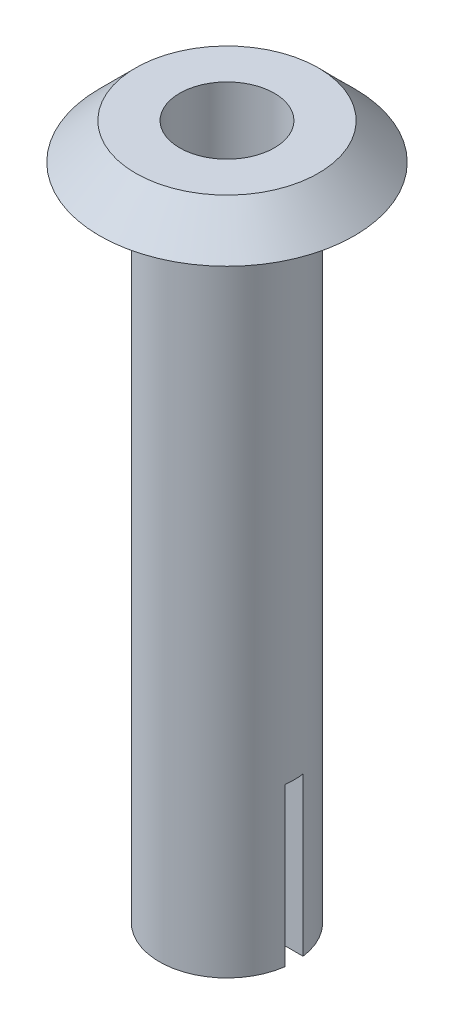
ISO-10303-21;
HEADER;
FILE_DESCRIPTION(('STEP AP214'),'2;1');
FILE_NAME('part.step','',(''),(''),'','','');
FILE_SCHEMA(('AUTOMOTIVE_DESIGN { 1 0 10303 214 1 1 1 1 }'));
ENDSEC;
DATA;
#1=APPLICATION_CONTEXT('core data for automotive mechanical design processes');
#2=APPLICATION_PROTOCOL_DEFINITION('international standard','automotive_design',2000,#1);
#3=PRODUCT_CONTEXT('',#1,'mechanical');
#4=PRODUCT('Part','Part','',(#3));
#5=PRODUCT_RELATED_PRODUCT_CATEGORY('part','',(#4));
#6=PRODUCT_DEFINITION_FORMATION('','',#4);
#7=PRODUCT_DEFINITION_CONTEXT('part definition',#1,'design');
#8=PRODUCT_DEFINITION('design','',#6,#7);
#9=PRODUCT_DEFINITION_SHAPE('','',#8);
#10=(LENGTH_UNIT() NAMED_UNIT(*) SI_UNIT(.MILLI.,.METRE.));
#11=(NAMED_UNIT(*) PLANE_ANGLE_UNIT() SI_UNIT($,.RADIAN.));
#12=(NAMED_UNIT(*) SI_UNIT($,.STERADIAN.) SOLID_ANGLE_UNIT());
#13=UNCERTAINTY_MEASURE_WITH_UNIT(LENGTH_MEASURE(1.E-05),#10,'distance_accuracy_value','');
#14=(GEOMETRIC_REPRESENTATION_CONTEXT(3) GLOBAL_UNCERTAINTY_ASSIGNED_CONTEXT((#13)) GLOBAL_UNIT_ASSIGNED_CONTEXT((#10,
#11,#12)) REPRESENTATION_CONTEXT('',''));
#15=CARTESIAN_POINT('',(0.,0.,0.));
#16=DIRECTION('',(0.,0.,1.));
#17=DIRECTION('',(1.,0.,0.));
#18=AXIS2_PLACEMENT_3D('',#15,#16,#17);
#19=CARTESIAN_POINT('',(0.,0.,0.));
#20=DIRECTION('',(0.,1.,0.));
#21=DIRECTION('',(0.,0.,1.));
#22=AXIS2_PLACEMENT_3D('',#19,#20,#21);
#23=PLANE('',#22);
#24=CARTESIAN_POINT('',(0.,0.,0.));
#25=DIRECTION('',(0.,1.,0.));
#26=DIRECTION('',(0.,0.,1.));
#27=AXIS2_PLACEMENT_3D('',#24,#25,#26);
#28=CIRCLE('',#27,1.5);
#29=CARTESIAN_POINT('',(1.48660687473185,0.,-0.2));
#30=VERTEX_POINT('',#29);
#31=CARTESIAN_POINT('',(-1.48660687473185,0.,-0.2));
#32=VERTEX_POINT('',#31);
#33=EDGE_CURVE('E130',#30,#32,#28,.T.);
#34=ORIENTED_EDGE('',*,*,#33,.F.);
#35=DIRECTION('',(1.,0.,0.));
#36=VECTOR('',#35,1.);
#37=CARTESIAN_POINT('',(-1.5,0.,-0.2));
#38=LINE('',#37,#36);
#39=EDGE_CURVE('E117',#32,#30,#38,.T.);
#40=ORIENTED_EDGE('',*,*,#39,.F.);
#41=EDGE_LOOP('',(#34,#40));
#42=FACE_BOUND('',#41,.T.);
#43=ADVANCED_FACE('F34',(#42),#23,.F.);
#44=CARTESIAN_POINT('',(0.,1.5001,0.));
#45=DIRECTION('',(0.,1.,0.));
#46=DIRECTION('',(0.,0.,1.));
#47=AXIS2_PLACEMENT_3D('',#44,#45,#46);
#48=PLANE('',#47);
#49=DIRECTION('',(-1.,0.,0.));
#50=VECTOR('',#49,1.);
#51=CARTESIAN_POINT('',(0.,1.5001,-0.2));
#52=LINE('',#51,#50);
#53=CARTESIAN_POINT('',(0.15,1.5001,-0.2));
#54=VERTEX_POINT('',#53);
#55=CARTESIAN_POINT('',(-0.150000000000001,1.50009999999999,-0.2));
#56=VERTEX_POINT('',#55);
#57=EDGE_CURVE('E127',#54,#56,#52,.T.);
#58=ORIENTED_EDGE('',*,*,#57,.F.);
#59=CARTESIAN_POINT('',(0.,1.5001,0.));
#60=DIRECTION('',(0.,1.,0.));
#61=DIRECTION('',(0.,0.,1.));
#62=AXIS2_PLACEMENT_3D('',#59,#60,#61);
#63=CIRCLE('',#62,0.25);
#64=EDGE_CURVE('E151',#54,#56,#63,.T.);
#65=ORIENTED_EDGE('',*,*,#64,.T.);
#66=EDGE_LOOP('',(#58,#65));
#67=FACE_BOUND('',#66,.T.);
#68=ADVANCED_FACE('F176',(#67),#48,.T.);
#69=CARTESIAN_POINT('',(0.,2.3001,0.));
#70=DIRECTION('',(0.,1.,0.));
#71=DIRECTION('',(0.,0.,1.));
#72=AXIS2_PLACEMENT_3D('',#69,#70,#71);
#73=DEGENERATE_TOROIDAL_SURFACE('',#72,0.25,0.8,.T.);
#74=ORIENTED_EDGE('',*,*,#64,.F.);
#75=CARTESIAN_POINT('',(0.,1.50166402886642,-0.2));
#76=CARTESIAN_POINT('',(0.0166698415826688,1.50166571667046,-0.2));
#77=CARTESIAN_POINT('',(0.0333398856129194,1.5015243846989,-0.2));
#78=CARTESIAN_POINT('',(0.0666781693266342,1.50108013124724,-0.2));
#79=CARTESIAN_POINT('',(0.0833464085193591,1.50077718944308,-0.2));
#80=CARTESIAN_POINT('',(0.1334092614839,1.50005060911422,-0.2));
#81=CARTESIAN_POINT('',(0.166812993914217,1.49981064587632,-0.2));
#82=CARTESIAN_POINT('',(0.229406412635807,1.50162846407508,-0.2));
#83=CARTESIAN_POINT('',(0.258601027229079,1.5034028341242,-0.2));
#84=CARTESIAN_POINT('',(0.316743266893158,1.50943838792807,-0.2));
#85=CARTESIAN_POINT('',(0.345690900061749,1.51369948982991,-0.2));
#86=CARTESIAN_POINT('',(0.402991969738191,1.52499097991025,-0.2));
#87=CARTESIAN_POINT('',(0.43134645596889,1.53201594533592,-0.2));
#88=CARTESIAN_POINT('',(0.487189985294854,1.54892644422566,-0.2));
#89=CARTESIAN_POINT('',(0.51467891698504,1.55881234426391,-0.2));
#90=CARTESIAN_POINT('',(0.583350982841369,1.58770457877811,-0.2));
#91=CARTESIAN_POINT('',(0.623707050723279,1.608732010134,-0.2));
#92=CARTESIAN_POINT('',(0.70034544039585,1.65728696231791,-0.2));
#93=CARTESIAN_POINT('',(0.736623667136238,1.68482093259039,-0.2));
#94=CARTESIAN_POINT('',(0.8039971339138,1.74568309567333,-0.2));
#95=CARTESIAN_POINT('',(0.835088877571679,1.77901516649863,-0.2));
#96=CARTESIAN_POINT('',(0.891088036855366,1.85049982703332,-0.2));
#97=CARTESIAN_POINT('',(0.91599833710029,1.88865015567519,-0.2));
#98=CARTESIAN_POINT('',(0.958481280077041,1.96790347324701,-0.2));
#99=CARTESIAN_POINT('',(0.976184281869382,2.00893663331438,-0.2));
#100=CARTESIAN_POINT('',(1.00439993048064,2.09340914612502,-0.2));
#101=CARTESIAN_POINT('',(1.01491219899784,2.13684862533388,-0.2));
#102=CARTESIAN_POINT('',(1.02838751393651,2.22458296266082,-0.2));
#103=CARTESIAN_POINT('',(1.03140084062819,2.26887010627033,-0.2));
#104=CARTESIAN_POINT('',(1.02993685654376,2.35732453651702,-0.2));
#105=CARTESIAN_POINT('',(1.02545891825336,2.40149181280298,-0.2));
#106=CARTESIAN_POINT('',(1.00915342271604,2.48838340979925,-0.2));
#107=CARTESIAN_POINT('',(0.997336178055473,2.5311096666496,-0.2));
#108=CARTESIAN_POINT('',(0.966713242045891,2.61395512181443,-0.2));
#109=CARTESIAN_POINT('',(0.947910965567331,2.6540755828194,-0.2));
#110=CARTESIAN_POINT('',(0.903839144046234,2.73065069145779,-0.2));
#111=CARTESIAN_POINT('',(0.878562317198208,2.76710114677823,-0.2));
#112=CARTESIAN_POINT('',(0.822245470323173,2.83532842733279,-0.2));
#113=CARTESIAN_POINT('',(0.791196792082228,2.86709810098076,-0.2));
#114=CARTESIAN_POINT('',(0.724008067566469,2.92527142435174,-0.2));
#115=CARTESIAN_POINT('',(0.687830871368458,2.95163214192628,-0.2));
#116=CARTESIAN_POINT('',(0.611776285106589,2.9979354345787,-0.2));
#117=CARTESIAN_POINT('',(0.571913327608463,3.01790178231344,-0.2));
#118=CARTESIAN_POINT('',(0.488698905847722,3.05152795161462,-0.2));
#119=CARTESIAN_POINT('',(0.445293861557957,3.06505457212068,-0.2));
#120=CARTESIAN_POINT('',(0.356717442684082,3.08530811915976,-0.2));
#121=CARTESIAN_POINT('',(0.311537986720364,3.09199895064935,-0.2));
#122=CARTESIAN_POINT('',(0.243810832825528,3.09765746387715,-0.2));
#123=CARTESIAN_POINT('',(0.221405555467714,3.09882104800239,-0.2));
#124=CARTESIAN_POINT('',(0.176559166379535,3.10008848768721,-0.2));
#125=CARTESIAN_POINT('',(0.154118045261468,3.10019199329407,-0.2));
#126=CARTESIAN_POINT('',(0.109196727516646,3.09986873007227,-0.2));
#127=CARTESIAN_POINT('',(0.086716553458095,3.09944079485711,-0.2));
#128=CARTESIAN_POINT('',(0.0417602725450971,3.09876428051567,-0.2));
#129=CARTESIAN_POINT('',(0.0192841675849667,3.09851563069695,-0.2));
#130=CARTESIAN_POINT('',(-0.0256602785195892,3.0985594930865,-0.2));
#131=CARTESIAN_POINT('',(-0.0481286199316127,3.09885183940198,-0.2));
#132=CARTESIAN_POINT('',(-0.0930716344119249,3.09955118293042,-0.2));
#133=CARTESIAN_POINT('',(-0.11554630617063,3.09995822829498,-0.2));
#134=CARTESIAN_POINT('',(-0.160455392283717,3.10018035007007,-0.2));
#135=CARTESIAN_POINT('',(-0.182889787694873,3.09999671397185,-0.2));
#136=CARTESIAN_POINT('',(-0.227717260508837,3.09852636404797,-0.2));
#137=CARTESIAN_POINT('',(-0.250110352920595,3.09724019939141,-0.2));
#138=CARTESIAN_POINT('',(-0.296297968778293,3.09312072295697,-0.2));
#139=CARTESIAN_POINT('',(-0.320084183523528,3.09018810205309,-0.2));
#140=CARTESIAN_POINT('',(-0.367381071661446,3.08251258442502,-0.2));
#141=CARTESIAN_POINT('',(-0.390891486534654,3.07776811045488,-0.2));
#142=CARTESIAN_POINT('',(-0.460460798783884,3.06072186606951,-0.2));
#143=CARTESIAN_POINT('',(-0.505869337426221,3.04558316011647,-0.2));
#144=CARTESIAN_POINT('',(-0.593621321286191,3.00758337797835,-0.2));
#145=CARTESIAN_POINT('',(-0.635946841713136,2.98468093791962,-0.2));
#146=CARTESIAN_POINT('',(-0.716023573084662,2.93160345969393,-0.2));
#147=CARTESIAN_POINT('',(-0.753756166231605,2.90140021266384,-0.2));
#148=CARTESIAN_POINT('',(-0.82122693284102,2.83652498131007,-0.2));
#149=CARTESIAN_POINT('',(-0.85129133705298,2.80219152148355,-0.2));
#150=CARTESIAN_POINT('',(-0.905034875406045,2.72893181931438,-0.2));
#151=CARTESIAN_POINT('',(-0.928725093673388,2.69001372097015,-0.2));
#152=CARTESIAN_POINT('',(-0.968651849943626,2.60950280684566,-0.2));
#153=CARTESIAN_POINT('',(-0.985028556964881,2.5679794247673,-0.2));
#154=CARTESIAN_POINT('',(-1.01053977879569,2.48274183353331,-0.2));
#155=CARTESIAN_POINT('',(-1.01967100083736,2.43902663787444,-0.2));
#156=CARTESIAN_POINT('',(-1.03037488252278,2.35095439400306,-0.2));
#157=CARTESIAN_POINT('',(-1.0319936625118,2.30660294352136,-0.2));
#158=CARTESIAN_POINT('',(-1.02775164201873,2.21826517229983,-0.2));
#159=CARTESIAN_POINT('',(-1.0218918980028,2.17427880086995,-0.2));
#160=CARTESIAN_POINT('',(-1.00287715257568,2.08796873376396,-0.2));
#161=CARTESIAN_POINT('',(-0.989730984078272,2.0456430912738,-0.2));
#162=CARTESIAN_POINT('',(-0.956532739392012,1.9637942509764,-0.2));
#163=CARTESIAN_POINT('',(-0.936480727484413,1.92427102708769,-0.2));
#164=CARTESIAN_POINT('',(-0.89000930653147,1.84906071693307,-0.2));
#165=CARTESIAN_POINT('',(-0.863577783044371,1.81338111826882,-0.2));
#166=CARTESIAN_POINT('',(-0.805135950061446,1.74692476724933,-0.2));
#167=CARTESIAN_POINT('',(-0.773124960237336,1.71614861366918,-0.2));
#168=CARTESIAN_POINT('',(-0.704201964591778,1.66011251929112,-0.2));
#169=CARTESIAN_POINT('',(-0.667255690928788,1.63489475116404,-0.2));
#170=CARTESIAN_POINT('',(-0.589750741014979,1.59087804904981,-0.2));
#171=CARTESIAN_POINT('',(-0.549193354238049,1.5720768353066,-0.2));
#172=CARTESIAN_POINT('',(-0.464618124035503,1.54082506566216,-0.2));
#173=CARTESIAN_POINT('',(-0.420541481173459,1.52853355976589,-0.2));
#174=CARTESIAN_POINT('',(-0.353478204694671,1.51519374710883,-0.2));
#175=CARTESIAN_POINT('',(-0.330958738023759,1.51159639946551,-0.2));
#176=CARTESIAN_POINT('',(-0.285725184481576,1.50596298451672,-0.2));
#177=CARTESIAN_POINT('',(-0.263011112275252,1.50392680059455,-0.2));
#178=CARTESIAN_POINT('',(-0.220265046414644,1.50134704085338,-0.2));
#179=CARTESIAN_POINT('',(-0.200241187409336,1.50065263236869,-0.2));
#180=CARTESIAN_POINT('',(-0.160181956336417,1.50000890941707,-0.2));
#181=CARTESIAN_POINT('',(-0.140146582936294,1.50005971462649,-0.2));
#182=CARTESIAN_POINT('',(-0.100092386262173,1.50048895406501,-0.2));
#183=CARTESIAN_POINT('',(-0.0800735597774635,1.50086721965425,-0.2));
#184=CARTESIAN_POINT('',(-0.0400365856593522,1.50145372536468,-0.2));
#185=CARTESIAN_POINT('',(-0.0200184388052065,1.50166200202041,-0.2));
#186=CARTESIAN_POINT('',(0.,1.50166402886642,-0.2));
#187=B_SPLINE_CURVE_WITH_KNOTS('',3,(#75,#76,#77,#78,#79,#80,#81,#82,#83,#84,#85,#86,#87,#88,
#89,#90,#91,#92,#93,#94,#95,#96,#97,#98,#99,#100,#101,#102,#103,#104,#105,#106,#107,#108,#109,
#110,#111,#112,#113,#114,#115,#116,#117,#118,#119,#120,#121,#122,#123,#124,#125,#126,#127,#128,
#129,#130,#131,#132,#133,#134,#135,#136,#137,#138,#139,#140,#141,#142,#143,#144,#145,#146,#147,
#148,#149,#150,#151,#152,#153,#154,#155,#156,#157,#158,#159,#160,#161,#162,#163,#164,#165,#166,
#167,#168,#169,#170,#171,#172,#173,#174,#175,#176,#177,#178,#179,#180,#181,#182,#183,#184,#185,
#186),.UNSPECIFIED.,.T.,.F.,(4,2,2,2,2,2,2,2,2,2,2,2,2,2,2,2,2,2,2,2,2,2,2,2,2,2,2,2,2,2,2,2,2,
2,2,2,2,2,2,2,2,2,2,2,2,2,2,2,2,2,2,2,2,2,2,4),(0.,0.0500092875870138,0.100024865829181,
0.200203184706985,0.287861777597849,0.375517485293757,0.463002061677427,0.550497852506859,
0.686345267481207,0.822327906861565,0.958401849368154,1.09441217197756,1.22783965644739,
1.36127415994634,1.49381154741136,1.62636003757694,1.75872270162411,1.8910207406544,
2.02346823117991,2.15611603011067,2.28977910205329,2.42293931893524,2.55874556687355,
2.69526526367023,2.76254952674017,2.82985600094964,2.89731045831805,2.96473830375306,
3.03214547632458,3.09958098925381,3.16686961463669,3.23412474304008,3.3059556878525,
3.37784930567182,3.52070973803225,3.66434359216108,3.80854154820458,3.94478310926737,
4.08078620473341,4.21405728780716,4.34738890234448,4.4799008756818,4.61239413156609,
4.74472712366483,4.87705888400943,5.00964394211279,5.14224517820572,5.27582027582979,
5.40934786564634,5.54600276763964,5.6143717931752,5.68273571114481,5.74282493822376,
5.80292381533889,5.86299176034259,5.9230467919569),.UNSPECIFIED.);
#188=CARTESIAN_POINT('',(1.03077640640442,2.3001,-0.2));
#189=VERTEX_POINT('',#188);
#190=EDGE_CURVE('E252',#54,#189,#187,.T.);
#191=ORIENTED_EDGE('',*,*,#190,.T.);
#192=CARTESIAN_POINT('',(0.,2.3001,0.));
#193=DIRECTION('',(0.,1.,0.));
#194=DIRECTION('',(0.,0.,1.));
#195=AXIS2_PLACEMENT_3D('',#192,#193,#194);
#196=CIRCLE('',#195,1.05);
#197=CARTESIAN_POINT('',(-1.03077640641938,2.30010000000522,-0.2));
#198=VERTEX_POINT('',#197);
#199=EDGE_CURVE('E155',#198,#189,#196,.F.);
#200=ORIENTED_EDGE('',*,*,#199,.F.);
#201=EDGE_CURVE('E161',#198,#56,#187,.T.);
#202=ORIENTED_EDGE('',*,*,#201,.T.);
#203=EDGE_LOOP('',(#74,#191,#200,#202));
#204=FACE_BOUND('',#203,.T.);
#205=ADVANCED_FACE('F196',(#204),#73,.F.);
#206=CARTESIAN_POINT('',(0.,15.4,0.));
#207=DIRECTION('',(0.,-1.,0.));
#208=DIRECTION('',(0.,0.,-1.));
#209=AXIS2_PLACEMENT_3D('',#206,#207,#208);
#210=CYLINDRICAL_SURFACE('',#209,1.5);
#211=CARTESIAN_POINT('',(0.,3.5,0.));
#212=DIRECTION('',(0.,-1.,0.));
#213=DIRECTION('',(0.,0.,-1.));
#214=AXIS2_PLACEMENT_3D('',#211,#212,#213);
#215=CIRCLE('',#214,1.5);
#216=CARTESIAN_POINT('',(1.48660687473185,3.5,-0.2));
#217=VERTEX_POINT('',#216);
#218=CARTESIAN_POINT('',(1.48660687473185,3.5,0.2));
#219=VERTEX_POINT('',#218);
#220=EDGE_CURVE('E214',#217,#219,#215,.T.);
#221=ORIENTED_EDGE('',*,*,#220,.F.);
#222=DIRECTION('',(0.,-1.,0.));
#223=VECTOR('',#222,1.);
#224=CARTESIAN_POINT('',(1.48660687473185,15.4,-0.2));
#225=LINE('',#224,#223);
#226=EDGE_CURVE('E213',#217,#30,#225,.T.);
#227=ORIENTED_EDGE('',*,*,#226,.T.);
#228=ORIENTED_EDGE('',*,*,#33,.T.);
#229=DIRECTION('',(0.,-1.,0.));
#230=VECTOR('',#229,1.);
#231=CARTESIAN_POINT('',(-1.48660687473185,15.4,-0.2));
#232=LINE('',#231,#230);
#233=CARTESIAN_POINT('',(-1.48660687473185,3.5,-0.2));
#234=VERTEX_POINT('',#233);
#235=EDGE_CURVE('E212',#32,#234,#232,.F.);
#236=ORIENTED_EDGE('',*,*,#235,.T.);
#237=CARTESIAN_POINT('',(-1.48660687473185,3.5,0.2));
#238=VERTEX_POINT('',#237);
#239=EDGE_CURVE('E126',#238,#234,#215,.T.);
#240=ORIENTED_EDGE('',*,*,#239,.F.);
#241=DIRECTION('',(0.,-1.,0.));
#242=VECTOR('',#241,1.);
#243=CARTESIAN_POINT('',(-1.48660687473185,15.4,0.2));
#244=LINE('',#243,#242);
#245=CARTESIAN_POINT('',(-1.48660687473185,0.,0.2));
#246=VERTEX_POINT('',#245);
#247=EDGE_CURVE('E112',#238,#246,#244,.T.);
#248=ORIENTED_EDGE('',*,*,#247,.T.);
#249=CARTESIAN_POINT('',(1.48660687473185,0.,0.2));
#250=VERTEX_POINT('',#249);
#251=EDGE_CURVE('E124',#246,#250,#28,.T.);
#252=ORIENTED_EDGE('',*,*,#251,.T.);
#253=DIRECTION('',(0.,-1.,0.));
#254=VECTOR('',#253,1.);
#255=CARTESIAN_POINT('',(1.48660687473185,15.4,0.2));
#256=LINE('',#255,#254);
#257=EDGE_CURVE('E50',#250,#219,#256,.F.);
#258=ORIENTED_EDGE('',*,*,#257,.T.);
#259=EDGE_LOOP('',(#221,#227,#228,#236,#240,#248,#252,#258));
#260=FACE_BOUND('',#259,.T.);
#261=CARTESIAN_POINT('',(0.,14.6,0.));
#262=DIRECTION('',(0.,1.,0.));
#263=DIRECTION('',(0.,0.,1.));
#264=AXIS2_PLACEMENT_3D('',#261,#262,#263);
#265=CIRCLE('',#264,1.5);
#266=CARTESIAN_POINT('',(0.,14.6,1.5));
#267=VERTEX_POINT('',#266);
#268=EDGE_CURVE('E134',#267,#267,#265,.T.);
#269=ORIENTED_EDGE('',*,*,#268,.F.);
#270=EDGE_LOOP('',(#269));
#271=FACE_BOUND('',#270,.T.);
#272=ADVANCED_FACE('F122',(#260,#271),#210,.T.);
#273=ORIENTED_EDGE('',*,*,#251,.F.);
#274=DIRECTION('',(-1.,0.,0.));
#275=VECTOR('',#274,1.);
#276=CARTESIAN_POINT('',(-1.5,0.,0.2));
#277=LINE('',#276,#275);
#278=EDGE_CURVE('E108',#250,#246,#277,.T.);
#279=ORIENTED_EDGE('',*,*,#278,.F.);
#280=EDGE_LOOP('',(#273,#279));
#281=FACE_BOUND('',#280,.T.);
#282=ADVANCED_FACE('F129',(#281),#23,.F.);
#283=CARTESIAN_POINT('',(0.,14.6,0.));
#284=DIRECTION('',(0.,1.,0.));
#285=DIRECTION('',(0.,0.,1.));
#286=AXIS2_PLACEMENT_3D('',#283,#284,#285);
#287=PLANE('',#286);
#288=CARTESIAN_POINT('',(0.,14.6,0.));
#289=DIRECTION('',(0.,1.,0.));
#290=DIRECTION('',(0.,0.,1.));
#291=AXIS2_PLACEMENT_3D('',#288,#289,#290);
#292=CIRCLE('',#291,2.825);
#293=CARTESIAN_POINT('',(0.,14.6,2.825));
#294=VERTEX_POINT('',#293);
#295=EDGE_CURVE('E131',#294,#294,#292,.T.);
#296=ORIENTED_EDGE('',*,*,#295,.F.);
#297=EDGE_LOOP('',(#296));
#298=FACE_BOUND('',#297,.T.);
#299=ORIENTED_EDGE('',*,*,#268,.T.);
#300=EDGE_LOOP('',(#299));
#301=FACE_BOUND('',#300,.T.);
#302=ADVANCED_FACE('F186',(#298,#301),#287,.F.);
#303=CARTESIAN_POINT('',(0.,14.6,0.));
#304=DIRECTION('',(0.,1.,0.));
#305=DIRECTION('',(0.,0.,1.));
#306=AXIS2_PLACEMENT_3D('',#303,#304,#305);
#307=CYLINDRICAL_SURFACE('',#306,2.825);
#308=CARTESIAN_POINT('',(0.,14.6001,0.));
#309=DIRECTION('',(0.,1.,0.));
#310=DIRECTION('',(0.,0.,1.));
#311=AXIS2_PLACEMENT_3D('',#308,#309,#310);
#312=CIRCLE('',#311,2.825);
#313=CARTESIAN_POINT('',(0.,14.6001,2.825));
#314=VERTEX_POINT('',#313);
#315=EDGE_CURVE('E145',#314,#314,#312,.F.);
#316=ORIENTED_EDGE('',*,*,#315,.T.);
#317=EDGE_LOOP('',(#316));
#318=FACE_BOUND('',#317,.T.);
#319=ORIENTED_EDGE('',*,*,#295,.T.);
#320=EDGE_LOOP('',(#319));
#321=FACE_BOUND('',#320,.T.);
#322=ADVANCED_FACE('F184',(#318,#321),#307,.T.);
#323=CARTESIAN_POINT('',(0.,15.4001,0.));
#324=DIRECTION('',(0.,1.,0.));
#325=DIRECTION('',(0.,0.,1.));
#326=AXIS2_PLACEMENT_3D('',#323,#324,#325);
#327=PLANE('',#326);
#328=CARTESIAN_POINT('',(0.,15.4001,0.));
#329=DIRECTION('',(0.,1.,0.));
#330=DIRECTION('',(0.,0.,1.));
#331=AXIS2_PLACEMENT_3D('',#328,#329,#330);
#332=CIRCLE('',#331,1.05);
#333=CARTESIAN_POINT('',(0.,15.4001,1.05));
#334=VERTEX_POINT('',#333);
#335=EDGE_CURVE('E136',#334,#334,#332,.T.);
#336=ORIENTED_EDGE('',*,*,#335,.F.);
#337=EDGE_LOOP('',(#336));
#338=FACE_BOUND('',#337,.T.);
#339=CARTESIAN_POINT('',(0.,15.4001,0.));
#340=DIRECTION('',(0.,1.,0.));
#341=DIRECTION('',(0.,0.,1.));
#342=AXIS2_PLACEMENT_3D('',#339,#340,#341);
#343=CIRCLE('',#342,2.025);
#344=CARTESIAN_POINT('',(0.,15.4001,2.025));
#345=VERTEX_POINT('',#344);
#346=EDGE_CURVE('E142',#345,#345,#343,.T.);
#347=ORIENTED_EDGE('',*,*,#346,.T.);
#348=EDGE_LOOP('',(#347));
#349=FACE_BOUND('',#348,.T.);
#350=ADVANCED_FACE('F181',(#338,#349),#327,.T.);
#351=CARTESIAN_POINT('',(0.,15.4001,0.));
#352=DIRECTION('',(0.,-1.,0.));
#353=DIRECTION('',(0.,0.,-1.));
#354=AXIS2_PLACEMENT_3D('',#351,#352,#353);
#355=CONICAL_SURFACE('',#354,2.025,0.785398163397447);
#356=ORIENTED_EDGE('',*,*,#315,.F.);
#357=EDGE_LOOP('',(#356));
#358=FACE_BOUND('',#357,.T.);
#359=ORIENTED_EDGE('',*,*,#346,.F.);
#360=EDGE_LOOP('',(#359));
#361=FACE_BOUND('',#360,.T.);
#362=ADVANCED_FACE('F179',(#358,#361),#355,.T.);
#363=CARTESIAN_POINT('',(0.,1.5001,0.));
#364=DIRECTION('',(0.,1.,0.));
#365=DIRECTION('',(0.,0.,1.));
#366=AXIS2_PLACEMENT_3D('',#363,#364,#365);
#367=CYLINDRICAL_SURFACE('',#366,1.05);
#368=CARTESIAN_POINT('',(0.,3.5,0.));
#369=DIRECTION('',(0.,-1.,0.));
#370=DIRECTION('',(0.,0.,-1.));
#371=AXIS2_PLACEMENT_3D('',#368,#369,#370);
#372=CIRCLE('',#371,1.05);
#373=CARTESIAN_POINT('',(-1.03077640640442,3.5,-0.2));
#374=VERTEX_POINT('',#373);
#375=CARTESIAN_POINT('',(-1.03077640640442,3.5,0.2));
#376=VERTEX_POINT('',#375);
#377=EDGE_CURVE('E11',#374,#376,#372,.F.);
#378=ORIENTED_EDGE('',*,*,#377,.F.);
#379=DIRECTION('',(0.,1.,0.));
#380=VECTOR('',#379,1.);
#381=CARTESIAN_POINT('',(-1.03077640640442,1.5001,-0.2));
#382=LINE('',#381,#380);
#383=EDGE_CURVE('E245',#374,#198,#382,.F.);
#384=ORIENTED_EDGE('',*,*,#383,.T.);
#385=ORIENTED_EDGE('',*,*,#199,.T.);
#386=DIRECTION('',(0.,1.,0.));
#387=VECTOR('',#386,1.);
#388=CARTESIAN_POINT('',(1.03077640640442,1.5001,-0.2));
#389=LINE('',#388,#387);
#390=CARTESIAN_POINT('',(1.03077640640442,3.5,-0.2));
#391=VERTEX_POINT('',#390);
#392=EDGE_CURVE('E220',#189,#391,#389,.T.);
#393=ORIENTED_EDGE('',*,*,#392,.T.);
#394=CARTESIAN_POINT('',(1.03077640640442,3.5,0.2));
#395=VERTEX_POINT('',#394);
#396=EDGE_CURVE('E39',#395,#391,#372,.F.);
#397=ORIENTED_EDGE('',*,*,#396,.F.);
#398=DIRECTION('',(0.,1.,0.));
#399=VECTOR('',#398,1.);
#400=CARTESIAN_POINT('',(1.03077640640442,1.5001,0.2));
#401=LINE('',#400,#399);
#402=CARTESIAN_POINT('',(1.03077640641938,2.30010000000522,0.2));
#403=VERTEX_POINT('',#402);
#404=EDGE_CURVE('E235',#395,#403,#401,.F.);
#405=ORIENTED_EDGE('',*,*,#404,.T.);
#406=CARTESIAN_POINT('',(-1.03077640640442,2.3001,0.2));
#407=VERTEX_POINT('',#406);
#408=EDGE_CURVE('E152',#403,#407,#196,.F.);
#409=ORIENTED_EDGE('',*,*,#408,.T.);
#410=DIRECTION('',(0.,1.,0.));
#411=VECTOR('',#410,1.);
#412=CARTESIAN_POINT('',(-1.03077640640442,1.5001,0.2));
#413=LINE('',#412,#411);
#414=EDGE_CURVE('E238',#407,#376,#413,.T.);
#415=ORIENTED_EDGE('',*,*,#414,.T.);
#416=EDGE_LOOP('',(#378,#384,#385,#393,#397,#405,#409,#415));
#417=FACE_BOUND('',#416,.T.);
#418=ORIENTED_EDGE('',*,*,#335,.T.);
#419=EDGE_LOOP('',(#418));
#420=FACE_BOUND('',#419,.T.);
#421=ADVANCED_FACE('F174',(#417,#420),#367,.F.);
#422=DIRECTION('',(1.,0.,0.));
#423=VECTOR('',#422,1.);
#424=CARTESIAN_POINT('',(0.,1.5001,0.2));
#425=LINE('',#424,#423);
#426=CARTESIAN_POINT('',(-0.15,1.5001,0.2));
#427=VERTEX_POINT('',#426);
#428=CARTESIAN_POINT('',(0.15,1.5001,0.2));
#429=VERTEX_POINT('',#428);
#430=EDGE_CURVE('E57',#427,#429,#425,.T.);
#431=ORIENTED_EDGE('',*,*,#430,.F.);
#432=EDGE_CURVE('E148',#427,#429,#63,.T.);
#433=ORIENTED_EDGE('',*,*,#432,.T.);
#434=EDGE_LOOP('',(#431,#433));
#435=FACE_BOUND('',#434,.T.);
#436=ADVANCED_FACE('F171',(#435),#48,.T.);
#437=ORIENTED_EDGE('',*,*,#432,.F.);
#438=CARTESIAN_POINT('',(0.,1.50166402886642,0.2));
#439=CARTESIAN_POINT('',(-0.0166698415826688,1.50166571667046,0.2));
#440=CARTESIAN_POINT('',(-0.0333398856129194,1.5015243846989,0.2));
#441=CARTESIAN_POINT('',(-0.0666781693266342,1.50108013124724,0.2));
#442=CARTESIAN_POINT('',(-0.0833464085193591,1.50077718944308,0.2));
#443=CARTESIAN_POINT('',(-0.1334092614839,1.50005060911422,0.2));
#444=CARTESIAN_POINT('',(-0.166812993914217,1.49981064587632,0.2));
#445=CARTESIAN_POINT('',(-0.229406412635807,1.50162846407508,0.2));
#446=CARTESIAN_POINT('',(-0.258601027229079,1.5034028341242,0.2));
#447=CARTESIAN_POINT('',(-0.316743266893158,1.50943838792807,0.2));
#448=CARTESIAN_POINT('',(-0.345690900061749,1.51369948982991,0.2));
#449=CARTESIAN_POINT('',(-0.402991969738191,1.52499097991025,0.2));
#450=CARTESIAN_POINT('',(-0.43134645596889,1.53201594533592,0.2));
#451=CARTESIAN_POINT('',(-0.487189985294854,1.54892644422566,0.2));
#452=CARTESIAN_POINT('',(-0.51467891698504,1.55881234426391,0.2));
#453=CARTESIAN_POINT('',(-0.583350982841369,1.58770457877811,0.2));
#454=CARTESIAN_POINT('',(-0.623707050723279,1.608732010134,0.2));
#455=CARTESIAN_POINT('',(-0.70034544039585,1.65728696231791,0.2));
#456=CARTESIAN_POINT('',(-0.736623667136238,1.68482093259039,0.2));
#457=CARTESIAN_POINT('',(-0.8039971339138,1.74568309567333,0.2));
#458=CARTESIAN_POINT('',(-0.835088877571679,1.77901516649863,0.2));
#459=CARTESIAN_POINT('',(-0.891088036855366,1.85049982703332,0.2));
#460=CARTESIAN_POINT('',(-0.91599833710029,1.88865015567519,0.2));
#461=CARTESIAN_POINT('',(-0.958481280077041,1.96790347324701,0.2));
#462=CARTESIAN_POINT('',(-0.976184281869382,2.00893663331438,0.2));
#463=CARTESIAN_POINT('',(-1.00439993048064,2.09340914612502,0.2));
#464=CARTESIAN_POINT('',(-1.01491219899784,2.13684862533388,0.2));
#465=CARTESIAN_POINT('',(-1.02838751393651,2.22458296266082,0.2));
#466=CARTESIAN_POINT('',(-1.03140084062819,2.26887010627033,0.2));
#467=CARTESIAN_POINT('',(-1.02993685654376,2.35732453651702,0.2));
#468=CARTESIAN_POINT('',(-1.02545891825336,2.40149181280298,0.2));
#469=CARTESIAN_POINT('',(-1.00915342271604,2.48838340979925,0.2));
#470=CARTESIAN_POINT('',(-0.997336178055473,2.5311096666496,0.2));
#471=CARTESIAN_POINT('',(-0.966713242045891,2.61395512181443,0.2));
#472=CARTESIAN_POINT('',(-0.94791096556733,2.6540755828194,0.2));
#473=CARTESIAN_POINT('',(-0.903839144046234,2.73065069145779,0.2));
#474=CARTESIAN_POINT('',(-0.878562317198208,2.76710114677823,0.2));
#475=CARTESIAN_POINT('',(-0.822245470323173,2.83532842733279,0.2));
#476=CARTESIAN_POINT('',(-0.791196792082228,2.86709810098076,0.2));
#477=CARTESIAN_POINT('',(-0.724008067566469,2.92527142435174,0.2));
#478=CARTESIAN_POINT('',(-0.687830871368458,2.95163214192628,0.2));
#479=CARTESIAN_POINT('',(-0.611776285106589,2.9979354345787,0.2));
#480=CARTESIAN_POINT('',(-0.571913327608463,3.01790178231344,0.2));
#481=CARTESIAN_POINT('',(-0.488698905847722,3.05152795161462,0.2));
#482=CARTESIAN_POINT('',(-0.445293861557956,3.06505457212068,0.2));
#483=CARTESIAN_POINT('',(-0.356717442684082,3.08530811915976,0.2));
#484=CARTESIAN_POINT('',(-0.311537986720364,3.09199895064935,0.2));
#485=CARTESIAN_POINT('',(-0.243810832825528,3.09765746387715,0.2));
#486=CARTESIAN_POINT('',(-0.221405555467714,3.09882104800239,0.2));
#487=CARTESIAN_POINT('',(-0.176559166379535,3.10008848768721,0.2));
#488=CARTESIAN_POINT('',(-0.154118045261469,3.10019199329407,0.2));
#489=CARTESIAN_POINT('',(-0.109196727516647,3.09986873007227,0.2));
#490=CARTESIAN_POINT('',(-0.0867165534580955,3.09944079485711,0.2));
#491=CARTESIAN_POINT('',(-0.0417602725450975,3.09876428051567,0.2));
#492=CARTESIAN_POINT('',(-0.019284167584967,3.09851563069695,0.2));
#493=CARTESIAN_POINT('',(0.0256602785195889,3.0985594930865,0.2));
#494=CARTESIAN_POINT('',(0.0481286199316123,3.09885183940198,0.2));
#495=CARTESIAN_POINT('',(0.0930716344119245,3.09955118293042,0.2));
#496=CARTESIAN_POINT('',(0.115546306170629,3.09995822829498,0.2));
#497=CARTESIAN_POINT('',(0.160455392283717,3.10018035007007,0.2));
#498=CARTESIAN_POINT('',(0.182889787694872,3.09999671397185,0.2));
#499=CARTESIAN_POINT('',(0.227717260508836,3.09852636404797,0.2));
#500=CARTESIAN_POINT('',(0.250110352920595,3.09724019939141,0.2));
#501=CARTESIAN_POINT('',(0.296297968778293,3.09312072295697,0.2));
#502=CARTESIAN_POINT('',(0.320084183523528,3.09018810205309,0.2));
#503=CARTESIAN_POINT('',(0.367381071661446,3.08251258442502,0.2));
#504=CARTESIAN_POINT('',(0.390891486534654,3.07776811045488,0.2));
#505=CARTESIAN_POINT('',(0.460460798783883,3.06072186606951,0.2));
#506=CARTESIAN_POINT('',(0.50586933742622,3.04558316011647,0.2));
#507=CARTESIAN_POINT('',(0.593621321286191,3.00758337797835,0.2));
#508=CARTESIAN_POINT('',(0.635946841713136,2.98468093791962,0.2));
#509=CARTESIAN_POINT('',(0.716023573084662,2.93160345969393,0.2));
#510=CARTESIAN_POINT('',(0.753756166231605,2.90140021266384,0.2));
#511=CARTESIAN_POINT('',(0.82122693284102,2.83652498131007,0.2));
#512=CARTESIAN_POINT('',(0.85129133705298,2.80219152148355,0.2));
#513=CARTESIAN_POINT('',(0.905034875406046,2.72893181931438,0.2));
#514=CARTESIAN_POINT('',(0.928725093673388,2.69001372097015,0.2));
#515=CARTESIAN_POINT('',(0.968651849943626,2.60950280684566,0.2));
#516=CARTESIAN_POINT('',(0.985028556964881,2.5679794247673,0.2));
#517=CARTESIAN_POINT('',(1.01053977879569,2.48274183353331,0.2));
#518=CARTESIAN_POINT('',(1.01967100083736,2.43902663787444,0.2));
#519=CARTESIAN_POINT('',(1.03037488252278,2.35095439400306,0.2));
#520=CARTESIAN_POINT('',(1.0319936625118,2.30660294352136,0.2));
#521=CARTESIAN_POINT('',(1.02775164201873,2.21826517229983,0.2));
#522=CARTESIAN_POINT('',(1.0218918980028,2.17427880086995,0.2));
#523=CARTESIAN_POINT('',(1.00287715257568,2.08796873376396,0.2));
#524=CARTESIAN_POINT('',(0.989730984078273,2.0456430912738,0.2));
#525=CARTESIAN_POINT('',(0.956532739392012,1.9637942509764,0.2));
#526=CARTESIAN_POINT('',(0.936480727484413,1.92427102708769,0.2));
#527=CARTESIAN_POINT('',(0.89000930653147,1.84906071693307,0.2));
#528=CARTESIAN_POINT('',(0.863577783044371,1.81338111826882,0.2));
#529=CARTESIAN_POINT('',(0.805135950061446,1.74692476724933,0.2));
#530=CARTESIAN_POINT('',(0.773124960237336,1.71614861366918,0.2));
#531=CARTESIAN_POINT('',(0.704201964591778,1.66011251929112,0.2));
#532=CARTESIAN_POINT('',(0.667255690928788,1.63489475116404,0.2));
#533=CARTESIAN_POINT('',(0.589750741014979,1.59087804904981,0.2));
#534=CARTESIAN_POINT('',(0.54919335423805,1.5720768353066,0.2));
#535=CARTESIAN_POINT('',(0.464618124035503,1.54082506566216,0.2));
#536=CARTESIAN_POINT('',(0.420541481173459,1.52853355976589,0.2));
#537=CARTESIAN_POINT('',(0.353478204694671,1.51519374710883,0.2));
#538=CARTESIAN_POINT('',(0.330958738023759,1.51159639946551,0.2));
#539=CARTESIAN_POINT('',(0.285725184481576,1.50596298451672,0.2));
#540=CARTESIAN_POINT('',(0.263011112275252,1.50392680059455,0.2));
#541=CARTESIAN_POINT('',(0.220265046414644,1.50134704085338,0.2));
#542=CARTESIAN_POINT('',(0.200241187409337,1.50065263236869,0.2));
#543=CARTESIAN_POINT('',(0.160181956336417,1.50000890941707,0.2));
#544=CARTESIAN_POINT('',(0.140146582936295,1.50005971462649,0.2));
#545=CARTESIAN_POINT('',(0.100092386262173,1.50048895406501,0.2));
#546=CARTESIAN_POINT('',(0.0800735597774638,1.50086721965425,0.2));
#547=CARTESIAN_POINT('',(0.0400365856593522,1.50145372536468,0.2));
#548=CARTESIAN_POINT('',(0.0200184388052065,1.50166200202041,0.2));
#549=CARTESIAN_POINT('',(0.,1.50166402886642,0.2));
#550=B_SPLINE_CURVE_WITH_KNOTS('',3,(#438,#439,#440,#441,#442,#443,#444,#445,#446,#447,#448,
#449,#450,#451,#452,#453,#454,#455,#456,#457,#458,#459,#460,#461,#462,#463,#464,#465,#466,#467,
#468,#469,#470,#471,#472,#473,#474,#475,#476,#477,#478,#479,#480,#481,#482,#483,#484,#485,#486,
#487,#488,#489,#490,#491,#492,#493,#494,#495,#496,#497,#498,#499,#500,#501,#502,#503,#504,#505,
#506,#507,#508,#509,#510,#511,#512,#513,#514,#515,#516,#517,#518,#519,#520,#521,#522,#523,#524,
#525,#526,#527,#528,#529,#530,#531,#532,#533,#534,#535,#536,#537,#538,#539,#540,#541,#542,#543,
#544,#545,#546,#547,#548,#549),.UNSPECIFIED.,.T.,.F.,(4,2,2,2,2,2,2,2,2,2,2,2,2,2,2,2,2,2,2,2,2,
2,2,2,2,2,2,2,2,2,2,2,2,2,2,2,2,2,2,2,2,2,2,2,2,2,2,2,2,2,2,2,2,2,2,4),(0.,0.0500092875870138,
0.100024865829181,0.200203184706985,0.287861777597849,0.375517485293757,0.463002061677427,
0.550497852506859,0.686345267481207,0.822327906861565,0.958401849368154,1.09441217197756,
1.22783965644739,1.36127415994634,1.49381154741136,1.62636003757694,1.75872270162411,
1.8910207406544,2.02346823117991,2.15611603011067,2.28977910205329,2.42293931893524,
2.55874556687355,2.69526526367023,2.76254952674017,2.82985600094964,2.89731045831805,
2.96473830375306,3.03214547632458,3.09958098925381,3.16686961463669,3.23412474304008,
3.3059556878525,3.37784930567182,3.52070973803225,3.66434359216108,3.80854154820458,
3.94478310926737,4.08078620473341,4.21405728780716,4.34738890234448,4.4799008756818,
4.61239413156609,4.74472712366483,4.87705888400943,5.00964394211279,5.14224517820572,
5.27582027582979,5.40934786564634,5.54600276763964,5.6143717931752,5.68273571114481,
5.74282493822376,5.80292381533889,5.86299176034259,5.9230467919569),.UNSPECIFIED.);
#551=EDGE_CURVE('E160',#427,#407,#550,.T.);
#552=ORIENTED_EDGE('',*,*,#551,.T.);
#553=ORIENTED_EDGE('',*,*,#408,.F.);
#554=EDGE_CURVE('E156',#403,#429,#550,.T.);
#555=ORIENTED_EDGE('',*,*,#554,.T.);
#556=EDGE_LOOP('',(#437,#552,#553,#555));
#557=FACE_BOUND('',#556,.T.);
#558=ADVANCED_FACE('F36',(#557),#73,.F.);
#559=CARTESIAN_POINT('',(0.,3.5,0.));
#560=DIRECTION('',(0.,-1.,0.));
#561=DIRECTION('',(0.,0.,-1.));
#562=AXIS2_PLACEMENT_3D('',#559,#560,#561);
#563=PLANE('',#562);
#564=ORIENTED_EDGE('',*,*,#220,.T.);
#565=DIRECTION('',(-1.,0.,0.));
#566=VECTOR('',#565,1.);
#567=CARTESIAN_POINT('',(-1.5,3.5,0.2));
#568=LINE('',#567,#566);
#569=EDGE_CURVE('E231',#219,#395,#568,.T.);
#570=ORIENTED_EDGE('',*,*,#569,.T.);
#571=ORIENTED_EDGE('',*,*,#396,.T.);
#572=DIRECTION('',(1.,0.,0.));
#573=VECTOR('',#572,1.);
#574=CARTESIAN_POINT('',(-1.5,3.5,-0.2));
#575=LINE('',#574,#573);
#576=EDGE_CURVE('E233',#391,#217,#575,.T.);
#577=ORIENTED_EDGE('',*,*,#576,.T.);
#578=EDGE_LOOP('',(#564,#570,#571,#577));
#579=FACE_BOUND('',#578,.T.);
#580=ADVANCED_FACE('F230',(#579),#563,.T.);
#581=ORIENTED_EDGE('',*,*,#239,.T.);
#582=EDGE_CURVE('E262',#234,#374,#575,.T.);
#583=ORIENTED_EDGE('',*,*,#582,.T.);
#584=ORIENTED_EDGE('',*,*,#377,.T.);
#585=EDGE_CURVE('E236',#376,#238,#568,.T.);
#586=ORIENTED_EDGE('',*,*,#585,.T.);
#587=EDGE_LOOP('',(#581,#583,#584,#586));
#588=FACE_BOUND('',#587,.T.);
#589=ADVANCED_FACE('F267',(#588),#563,.T.);
#590=CARTESIAN_POINT('',(-1.5,3.5,-0.2));
#591=DIRECTION('',(0.,0.,-1.));
#592=DIRECTION('',(-1.,0.,0.));
#593=AXIS2_PLACEMENT_3D('',#590,#591,#592);
#594=PLANE('',#593);
#595=ORIENTED_EDGE('',*,*,#576,.F.);
#596=ORIENTED_EDGE('',*,*,#392,.F.);
#597=ORIENTED_EDGE('',*,*,#190,.F.);
#598=ORIENTED_EDGE('',*,*,#57,.T.);
#599=ORIENTED_EDGE('',*,*,#201,.F.);
#600=ORIENTED_EDGE('',*,*,#383,.F.);
#601=ORIENTED_EDGE('',*,*,#582,.F.);
#602=ORIENTED_EDGE('',*,*,#235,.F.);
#603=ORIENTED_EDGE('',*,*,#39,.T.);
#604=ORIENTED_EDGE('',*,*,#226,.F.);
#605=EDGE_LOOP('',(#595,#596,#597,#598,#599,#600,#601,#602,#603,#604));
#606=FACE_BOUND('',#605,.T.);
#607=ADVANCED_FACE('F168',(#606),#594,.F.);
#608=CARTESIAN_POINT('',(-1.5,3.5,0.2));
#609=DIRECTION('',(0.,0.,1.));
#610=DIRECTION('',(1.,0.,0.));
#611=AXIS2_PLACEMENT_3D('',#608,#609,#610);
#612=PLANE('',#611);
#613=ORIENTED_EDGE('',*,*,#585,.F.);
#614=ORIENTED_EDGE('',*,*,#414,.F.);
#615=ORIENTED_EDGE('',*,*,#551,.F.);
#616=ORIENTED_EDGE('',*,*,#430,.T.);
#617=ORIENTED_EDGE('',*,*,#554,.F.);
#618=ORIENTED_EDGE('',*,*,#404,.F.);
#619=ORIENTED_EDGE('',*,*,#569,.F.);
#620=ORIENTED_EDGE('',*,*,#257,.F.);
#621=ORIENTED_EDGE('',*,*,#278,.T.);
#622=ORIENTED_EDGE('',*,*,#247,.F.);
#623=EDGE_LOOP('',(#613,#614,#615,#616,#617,#618,#619,#620,#621,#622));
#624=FACE_BOUND('',#623,.T.);
#625=ADVANCED_FACE('F111',(#624),#612,.F.);
#626=CLOSED_SHELL('',(#43,#68,#205,#272,#282,#302,#322,#350,#362,#421,#436,#558,#580,#589,#607,#625));
#627=MANIFOLD_SOLID_BREP('B2',#626);
#628=ADVANCED_BREP_SHAPE_REPRESENTATION('',(#18,#627),#14);
#629=SHAPE_DEFINITION_REPRESENTATION(#9,#628);
ENDSEC;
END-ISO-10303-21;
